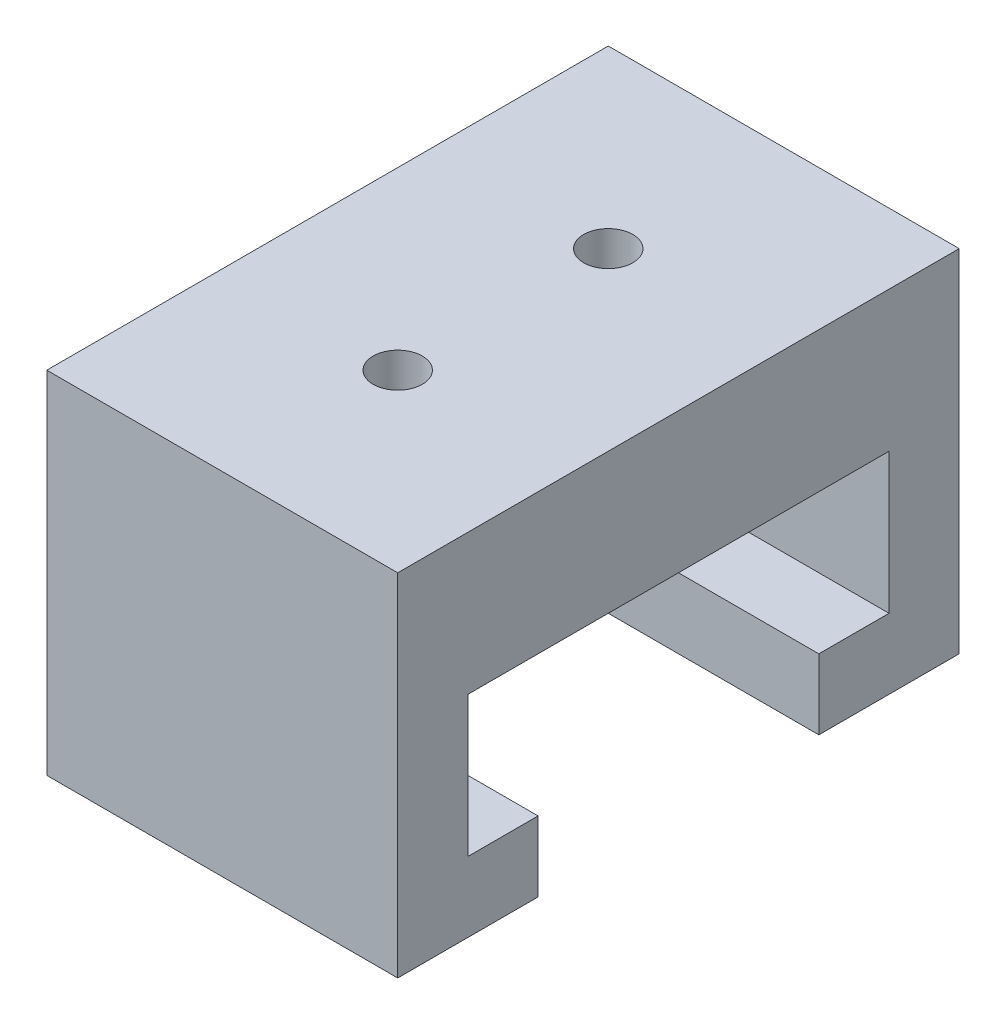
ISO-10303-21;
HEADER;
FILE_DESCRIPTION(('STEP AP214'),'2;1');
FILE_NAME('part.step','',(''),(''),'','','');
FILE_SCHEMA(('AUTOMOTIVE_DESIGN { 1 0 10303 214 1 1 1 1 }'));
ENDSEC;
DATA;
#1=APPLICATION_CONTEXT('core data for automotive mechanical design processes');
#2=APPLICATION_PROTOCOL_DEFINITION('international standard','automotive_design',2000,#1);
#3=PRODUCT_CONTEXT('',#1,'mechanical');
#4=PRODUCT('Part','Part','',(#3));
#5=PRODUCT_RELATED_PRODUCT_CATEGORY('part','',(#4));
#6=PRODUCT_DEFINITION_FORMATION('','',#4);
#7=PRODUCT_DEFINITION_CONTEXT('part definition',#1,'design');
#8=PRODUCT_DEFINITION('design','',#6,#7);
#9=PRODUCT_DEFINITION_SHAPE('','',#8);
#10=(LENGTH_UNIT() NAMED_UNIT(*) SI_UNIT(.MILLI.,.METRE.));
#11=(NAMED_UNIT(*) PLANE_ANGLE_UNIT() SI_UNIT($,.RADIAN.));
#12=(NAMED_UNIT(*) SI_UNIT($,.STERADIAN.) SOLID_ANGLE_UNIT());
#13=UNCERTAINTY_MEASURE_WITH_UNIT(LENGTH_MEASURE(1.E-05),#10,'distance_accuracy_value','');
#14=(GEOMETRIC_REPRESENTATION_CONTEXT(3) GLOBAL_UNCERTAINTY_ASSIGNED_CONTEXT((#13)) GLOBAL_UNIT_ASSIGNED_CONTEXT((#10,
#11,#12)) REPRESENTATION_CONTEXT('',''));
#15=CARTESIAN_POINT('',(0.,0.,0.));
#16=DIRECTION('',(0.,0.,1.));
#17=DIRECTION('',(1.,0.,0.));
#18=AXIS2_PLACEMENT_3D('',#15,#16,#17);
#19=CARTESIAN_POINT('',(62.5,-133.,21.25));
#20=DIRECTION('',(0.,-1.,0.));
#21=DIRECTION('',(0.,0.,-1.));
#22=AXIS2_PLACEMENT_3D('',#19,#20,#21);
#23=CYLINDRICAL_SURFACE('',#22,1.75);
#24=CARTESIAN_POINT('',(62.5,-150.,21.25));
#25=DIRECTION('',(0.,1.,0.));
#26=DIRECTION('',(0.,0.,1.));
#27=AXIS2_PLACEMENT_3D('',#24,#25,#26);
#28=CIRCLE('',#27,1.75);
#29=CARTESIAN_POINT('',(62.5,-150.,23.));
#30=VERTEX_POINT('',#29);
#31=EDGE_CURVE('E223',#30,#30,#28,.T.);
#32=ORIENTED_EDGE('',*,*,#31,.T.);
#33=EDGE_LOOP('',(#32));
#34=FACE_BOUND('',#33,.T.);
#35=CARTESIAN_POINT('',(62.5,-155.,21.25));
#36=DIRECTION('',(0.,-1.,0.));
#37=DIRECTION('',(0.,0.,-1.));
#38=AXIS2_PLACEMENT_3D('',#35,#36,#37);
#39=CIRCLE('',#38,1.75);
#40=CARTESIAN_POINT('',(62.5,-155.,19.5));
#41=VERTEX_POINT('',#40);
#42=EDGE_CURVE('E47',#41,#41,#39,.F.);
#43=ORIENTED_EDGE('',*,*,#42,.F.);
#44=EDGE_LOOP('',(#43));
#45=FACE_BOUND('',#44,.T.);
#46=ADVANCED_FACE('F43',(#34,#45),#23,.F.);
#47=CARTESIAN_POINT('',(62.5,-133.,36.25));
#48=DIRECTION('',(0.,-1.,0.));
#49=DIRECTION('',(0.,0.,-1.));
#50=AXIS2_PLACEMENT_3D('',#47,#48,#49);
#51=CYLINDRICAL_SURFACE('',#50,1.75);
#52=CARTESIAN_POINT('',(62.5,-150.,36.25));
#53=DIRECTION('',(0.,1.,0.));
#54=DIRECTION('',(0.,0.,1.));
#55=AXIS2_PLACEMENT_3D('',#52,#53,#54);
#56=CIRCLE('',#55,1.75);
#57=CARTESIAN_POINT('',(62.5,-150.,38.));
#58=VERTEX_POINT('',#57);
#59=EDGE_CURVE('E170',#58,#58,#56,.T.);
#60=ORIENTED_EDGE('',*,*,#59,.T.);
#61=EDGE_LOOP('',(#60));
#62=FACE_BOUND('',#61,.T.);
#63=CARTESIAN_POINT('',(62.5,-155.,36.25));
#64=DIRECTION('',(0.,-1.,0.));
#65=DIRECTION('',(0.,0.,-1.));
#66=AXIS2_PLACEMENT_3D('',#63,#64,#65);
#67=CIRCLE('',#66,1.75);
#68=CARTESIAN_POINT('',(62.5,-155.,34.5));
#69=VERTEX_POINT('',#68);
#70=EDGE_CURVE('E217',#69,#69,#67,.F.);
#71=ORIENTED_EDGE('',*,*,#70,.F.);
#72=EDGE_LOOP('',(#71));
#73=FACE_BOUND('',#72,.T.);
#74=ADVANCED_FACE('F298',(#62,#73),#51,.F.);
#75=CARTESIAN_POINT('',(50.,-175.,48.75));
#76=DIRECTION('',(0.,-1.,0.));
#77=DIRECTION('',(0.,0.,-1.));
#78=AXIS2_PLACEMENT_3D('',#75,#76,#77);
#79=PLANE('',#78);
#80=DIRECTION('',(0.,0.,-1.));
#81=VECTOR('',#80,1.);
#82=CARTESIAN_POINT('',(75.,-175.,48.75));
#83=LINE('',#82,#81);
#84=CARTESIAN_POINT('',(75.,-175.,48.75));
#85=VERTEX_POINT('',#84);
#86=CARTESIAN_POINT('',(75.,-175.,38.75));
#87=VERTEX_POINT('',#86);
#88=EDGE_CURVE('E166',#85,#87,#83,.T.);
#89=ORIENTED_EDGE('',*,*,#88,.F.);
#90=DIRECTION('',(1.,0.,0.));
#91=VECTOR('',#90,1.);
#92=CARTESIAN_POINT('',(50.,-175.,48.75));
#93=LINE('',#92,#91);
#94=CARTESIAN_POINT('',(50.,-175.,48.75));
#95=VERTEX_POINT('',#94);
#96=EDGE_CURVE('E11',#95,#85,#93,.T.);
#97=ORIENTED_EDGE('',*,*,#96,.F.);
#98=DIRECTION('',(0.,0.,-1.));
#99=VECTOR('',#98,1.);
#100=CARTESIAN_POINT('',(50.,-175.,48.75));
#101=LINE('',#100,#99);
#102=CARTESIAN_POINT('',(50.,-175.,38.75));
#103=VERTEX_POINT('',#102);
#104=EDGE_CURVE('E199',#95,#103,#101,.T.);
#105=ORIENTED_EDGE('',*,*,#104,.T.);
#106=DIRECTION('',(1.,0.,0.));
#107=VECTOR('',#106,1.);
#108=CARTESIAN_POINT('',(50.,-175.,38.75));
#109=LINE('',#108,#107);
#110=EDGE_CURVE('E112',#103,#87,#109,.T.);
#111=ORIENTED_EDGE('',*,*,#110,.T.);
#112=EDGE_LOOP('',(#89,#97,#105,#111));
#113=FACE_BOUND('',#112,.T.);
#114=ADVANCED_FACE('F45',(#113),#79,.T.);
#115=CARTESIAN_POINT('',(50.,-150.,48.75));
#116=DIRECTION('',(0.,0.,1.));
#117=DIRECTION('',(1.,0.,0.));
#118=AXIS2_PLACEMENT_3D('',#115,#116,#117);
#119=PLANE('',#118);
#120=DIRECTION('',(0.,-1.,0.));
#121=VECTOR('',#120,1.);
#122=CARTESIAN_POINT('',(75.,-150.,48.75));
#123=LINE('',#122,#121);
#124=CARTESIAN_POINT('',(75.,-150.,48.75));
#125=VERTEX_POINT('',#124);
#126=EDGE_CURVE('E197',#125,#85,#123,.T.);
#127=ORIENTED_EDGE('',*,*,#126,.F.);
#128=DIRECTION('',(1.,0.,0.));
#129=VECTOR('',#128,1.);
#130=CARTESIAN_POINT('',(50.,-150.,48.75));
#131=LINE('',#130,#129);
#132=CARTESIAN_POINT('',(50.,-150.,48.75));
#133=VERTEX_POINT('',#132);
#134=EDGE_CURVE('E53',#133,#125,#131,.T.);
#135=ORIENTED_EDGE('',*,*,#134,.F.);
#136=DIRECTION('',(0.,-1.,0.));
#137=VECTOR('',#136,1.);
#138=CARTESIAN_POINT('',(50.,-150.,48.75));
#139=LINE('',#138,#137);
#140=EDGE_CURVE('E156',#133,#95,#139,.T.);
#141=ORIENTED_EDGE('',*,*,#140,.T.);
#142=ORIENTED_EDGE('',*,*,#96,.T.);
#143=EDGE_LOOP('',(#127,#135,#141,#142));
#144=FACE_BOUND('',#143,.T.);
#145=ADVANCED_FACE('F288',(#144),#119,.T.);
#146=CARTESIAN_POINT('',(50.,-150.,8.74999999999997));
#147=DIRECTION('',(0.,1.,0.));
#148=DIRECTION('',(0.,0.,1.));
#149=AXIS2_PLACEMENT_3D('',#146,#147,#148);
#150=PLANE('',#149);
#151=ORIENTED_EDGE('',*,*,#59,.F.);
#152=EDGE_LOOP('',(#151));
#153=FACE_BOUND('',#152,.T.);
#154=ORIENTED_EDGE('',*,*,#31,.F.);
#155=EDGE_LOOP('',(#154));
#156=FACE_BOUND('',#155,.T.);
#157=DIRECTION('',(0.,0.,1.));
#158=VECTOR('',#157,1.);
#159=CARTESIAN_POINT('',(75.,-150.,8.74999999999997));
#160=LINE('',#159,#158);
#161=CARTESIAN_POINT('',(75.,-150.,8.74999999999997));
#162=VERTEX_POINT('',#161);
#163=EDGE_CURVE('E143',#162,#125,#160,.T.);
#164=ORIENTED_EDGE('',*,*,#163,.F.);
#165=DIRECTION('',(1.,0.,0.));
#166=VECTOR('',#165,1.);
#167=CARTESIAN_POINT('',(50.,-150.,8.74999999999997));
#168=LINE('',#167,#166);
#169=CARTESIAN_POINT('',(50.,-150.,8.74999999999997));
#170=VERTEX_POINT('',#169);
#171=EDGE_CURVE('E138',#170,#162,#168,.T.);
#172=ORIENTED_EDGE('',*,*,#171,.F.);
#173=DIRECTION('',(0.,0.,1.));
#174=VECTOR('',#173,1.);
#175=CARTESIAN_POINT('',(50.,-150.,8.74999999999997));
#176=LINE('',#175,#174);
#177=EDGE_CURVE('E141',#170,#133,#176,.T.);
#178=ORIENTED_EDGE('',*,*,#177,.T.);
#179=ORIENTED_EDGE('',*,*,#134,.T.);
#180=EDGE_LOOP('',(#164,#172,#178,#179));
#181=FACE_BOUND('',#180,.T.);
#182=ADVANCED_FACE('F140',(#153,#156,#181),#150,.T.);
#183=CARTESIAN_POINT('',(50.,-175.,8.74999999999997));
#184=DIRECTION('',(0.,0.,-1.));
#185=DIRECTION('',(-1.,0.,0.));
#186=AXIS2_PLACEMENT_3D('',#183,#184,#185);
#187=PLANE('',#186);
#188=DIRECTION('',(0.,1.,0.));
#189=VECTOR('',#188,1.);
#190=CARTESIAN_POINT('',(75.,-175.,8.74999999999997));
#191=LINE('',#190,#189);
#192=CARTESIAN_POINT('',(75.,-175.,8.74999999999997));
#193=VERTEX_POINT('',#192);
#194=EDGE_CURVE('E194',#193,#162,#191,.T.);
#195=ORIENTED_EDGE('',*,*,#194,.F.);
#196=DIRECTION('',(1.,0.,0.));
#197=VECTOR('',#196,1.);
#198=CARTESIAN_POINT('',(50.,-175.,8.74999999999997));
#199=LINE('',#198,#197);
#200=CARTESIAN_POINT('',(50.,-175.,8.74999999999997));
#201=VERTEX_POINT('',#200);
#202=EDGE_CURVE('E148',#201,#193,#199,.T.);
#203=ORIENTED_EDGE('',*,*,#202,.F.);
#204=DIRECTION('',(0.,1.,0.));
#205=VECTOR('',#204,1.);
#206=CARTESIAN_POINT('',(50.,-175.,8.74999999999997));
#207=LINE('',#206,#205);
#208=EDGE_CURVE('E154',#201,#170,#207,.T.);
#209=ORIENTED_EDGE('',*,*,#208,.T.);
#210=ORIENTED_EDGE('',*,*,#171,.T.);
#211=EDGE_LOOP('',(#195,#203,#209,#210));
#212=FACE_BOUND('',#211,.T.);
#213=ADVANCED_FACE('F158',(#212),#187,.T.);
#214=CARTESIAN_POINT('',(50.,-175.,18.75));
#215=DIRECTION('',(0.,-1.,0.));
#216=DIRECTION('',(0.,0.,-1.));
#217=AXIS2_PLACEMENT_3D('',#214,#215,#216);
#218=PLANE('',#217);
#219=DIRECTION('',(0.,0.,-1.));
#220=VECTOR('',#219,1.);
#221=CARTESIAN_POINT('',(75.,-175.,18.75));
#222=LINE('',#221,#220);
#223=CARTESIAN_POINT('',(75.,-175.,18.75));
#224=VERTEX_POINT('',#223);
#225=EDGE_CURVE('E191',#224,#193,#222,.T.);
#226=ORIENTED_EDGE('',*,*,#225,.F.);
#227=DIRECTION('',(1.,0.,0.));
#228=VECTOR('',#227,1.);
#229=CARTESIAN_POINT('',(50.,-175.,18.75));
#230=LINE('',#229,#228);
#231=CARTESIAN_POINT('',(50.,-175.,18.75));
#232=VERTEX_POINT('',#231);
#233=EDGE_CURVE('E203',#232,#224,#230,.T.);
#234=ORIENTED_EDGE('',*,*,#233,.F.);
#235=DIRECTION('',(0.,0.,-1.));
#236=VECTOR('',#235,1.);
#237=CARTESIAN_POINT('',(50.,-175.,18.75));
#238=LINE('',#237,#236);
#239=EDGE_CURVE('E159',#232,#201,#238,.T.);
#240=ORIENTED_EDGE('',*,*,#239,.T.);
#241=ORIENTED_EDGE('',*,*,#202,.T.);
#242=EDGE_LOOP('',(#226,#234,#240,#241));
#243=FACE_BOUND('',#242,.T.);
#244=ADVANCED_FACE('F425',(#243),#218,.T.);
#245=CARTESIAN_POINT('',(50.,-170.,18.75));
#246=DIRECTION('',(0.,0.,1.));
#247=DIRECTION('',(1.,0.,0.));
#248=AXIS2_PLACEMENT_3D('',#245,#246,#247);
#249=PLANE('',#248);
#250=DIRECTION('',(0.,-1.,0.));
#251=VECTOR('',#250,1.);
#252=CARTESIAN_POINT('',(75.,-170.,18.75));
#253=LINE('',#252,#251);
#254=CARTESIAN_POINT('',(75.,-170.,18.75));
#255=VERTEX_POINT('',#254);
#256=EDGE_CURVE('E188',#255,#224,#253,.T.);
#257=ORIENTED_EDGE('',*,*,#256,.F.);
#258=DIRECTION('',(1.,0.,0.));
#259=VECTOR('',#258,1.);
#260=CARTESIAN_POINT('',(50.,-170.,18.75));
#261=LINE('',#260,#259);
#262=CARTESIAN_POINT('',(50.,-170.,18.75));
#263=VERTEX_POINT('',#262);
#264=EDGE_CURVE('E205',#263,#255,#261,.T.);
#265=ORIENTED_EDGE('',*,*,#264,.F.);
#266=DIRECTION('',(0.,-1.,0.));
#267=VECTOR('',#266,1.);
#268=CARTESIAN_POINT('',(50.,-170.,18.75));
#269=LINE('',#268,#267);
#270=EDGE_CURVE('E161',#263,#232,#269,.T.);
#271=ORIENTED_EDGE('',*,*,#270,.T.);
#272=ORIENTED_EDGE('',*,*,#233,.T.);
#273=EDGE_LOOP('',(#257,#265,#271,#272));
#274=FACE_BOUND('',#273,.T.);
#275=ADVANCED_FACE('F263',(#274),#249,.T.);
#276=CARTESIAN_POINT('',(50.,-170.,13.75));
#277=DIRECTION('',(0.,1.,0.));
#278=DIRECTION('',(0.,0.,1.));
#279=AXIS2_PLACEMENT_3D('',#276,#277,#278);
#280=PLANE('',#279);
#281=DIRECTION('',(0.,0.,1.));
#282=VECTOR('',#281,1.);
#283=CARTESIAN_POINT('',(75.,-170.,13.75));
#284=LINE('',#283,#282);
#285=CARTESIAN_POINT('',(75.,-170.,13.75));
#286=VERTEX_POINT('',#285);
#287=EDGE_CURVE('E185',#286,#255,#284,.T.);
#288=ORIENTED_EDGE('',*,*,#287,.F.);
#289=DIRECTION('',(1.,0.,0.));
#290=VECTOR('',#289,1.);
#291=CARTESIAN_POINT('',(50.,-170.,13.75));
#292=LINE('',#291,#290);
#293=CARTESIAN_POINT('',(50.,-170.,13.75));
#294=VERTEX_POINT('',#293);
#295=EDGE_CURVE('E207',#294,#286,#292,.T.);
#296=ORIENTED_EDGE('',*,*,#295,.F.);
#297=DIRECTION('',(0.,0.,1.));
#298=VECTOR('',#297,1.);
#299=CARTESIAN_POINT('',(50.,-170.,13.75));
#300=LINE('',#299,#298);
#301=EDGE_CURVE('E257',#294,#263,#300,.T.);
#302=ORIENTED_EDGE('',*,*,#301,.T.);
#303=ORIENTED_EDGE('',*,*,#264,.T.);
#304=EDGE_LOOP('',(#288,#296,#302,#303));
#305=FACE_BOUND('',#304,.T.);
#306=ADVANCED_FACE('F269',(#305),#280,.T.);
#307=CARTESIAN_POINT('',(50.,-160.,13.75));
#308=DIRECTION('',(0.,0.,1.));
#309=DIRECTION('',(0.,-1.,0.));
#310=AXIS2_PLACEMENT_3D('',#307,#308,#309);
#311=PLANE('',#310);
#312=DIRECTION('',(0.,-1.,0.));
#313=VECTOR('',#312,1.);
#314=CARTESIAN_POINT('',(75.,-160.,13.75));
#315=LINE('',#314,#313);
#316=CARTESIAN_POINT('',(75.,-160.,13.75));
#317=VERTEX_POINT('',#316);
#318=EDGE_CURVE('E182',#317,#286,#315,.T.);
#319=ORIENTED_EDGE('',*,*,#318,.F.);
#320=DIRECTION('',(1.,0.,0.));
#321=VECTOR('',#320,1.);
#322=CARTESIAN_POINT('',(50.,-160.,13.75));
#323=LINE('',#322,#321);
#324=CARTESIAN_POINT('',(50.,-160.,13.75));
#325=VERTEX_POINT('',#324);
#326=EDGE_CURVE('E209',#325,#317,#323,.T.);
#327=ORIENTED_EDGE('',*,*,#326,.F.);
#328=DIRECTION('',(0.,-1.,0.));
#329=VECTOR('',#328,1.);
#330=CARTESIAN_POINT('',(50.,-160.,13.75));
#331=LINE('',#330,#329);
#332=EDGE_CURVE('E254',#325,#294,#331,.T.);
#333=ORIENTED_EDGE('',*,*,#332,.T.);
#334=ORIENTED_EDGE('',*,*,#295,.T.);
#335=EDGE_LOOP('',(#319,#327,#333,#334));
#336=FACE_BOUND('',#335,.T.);
#337=ADVANCED_FACE('F272',(#336),#311,.T.);
#338=CARTESIAN_POINT('',(50.,-160.,43.75));
#339=DIRECTION('',(0.,-1.,0.));
#340=DIRECTION('',(0.,0.,-1.));
#341=AXIS2_PLACEMENT_3D('',#338,#339,#340);
#342=PLANE('',#341);
#343=CARTESIAN_POINT('',(62.5,-160.,36.25));
#344=DIRECTION('',(0.,-1.,0.));
#345=DIRECTION('',(0.,0.,-1.));
#346=AXIS2_PLACEMENT_3D('',#343,#344,#345);
#347=CIRCLE('',#346,2.5);
#348=CARTESIAN_POINT('',(62.5,-160.,33.75));
#349=VERTEX_POINT('',#348);
#350=EDGE_CURVE('E219',#349,#349,#347,.T.);
#351=ORIENTED_EDGE('',*,*,#350,.F.);
#352=EDGE_LOOP('',(#351));
#353=FACE_BOUND('',#352,.T.);
#354=CARTESIAN_POINT('',(62.5,-160.,21.25));
#355=DIRECTION('',(0.,-1.,0.));
#356=DIRECTION('',(0.,0.,-1.));
#357=AXIS2_PLACEMENT_3D('',#354,#355,#356);
#358=CIRCLE('',#357,2.5);
#359=CARTESIAN_POINT('',(62.5,-160.,18.75));
#360=VERTEX_POINT('',#359);
#361=EDGE_CURVE('E230',#360,#360,#358,.T.);
#362=ORIENTED_EDGE('',*,*,#361,.F.);
#363=EDGE_LOOP('',(#362));
#364=FACE_BOUND('',#363,.T.);
#365=DIRECTION('',(0.,0.,-1.));
#366=VECTOR('',#365,1.);
#367=CARTESIAN_POINT('',(75.,-160.,43.75));
#368=LINE('',#367,#366);
#369=CARTESIAN_POINT('',(75.,-160.,43.75));
#370=VERTEX_POINT('',#369);
#371=EDGE_CURVE('E179',#370,#317,#368,.T.);
#372=ORIENTED_EDGE('',*,*,#371,.F.);
#373=DIRECTION('',(1.,0.,0.));
#374=VECTOR('',#373,1.);
#375=CARTESIAN_POINT('',(50.,-160.,43.75));
#376=LINE('',#375,#374);
#377=CARTESIAN_POINT('',(50.,-160.,43.75));
#378=VERTEX_POINT('',#377);
#379=EDGE_CURVE('E211',#378,#370,#376,.T.);
#380=ORIENTED_EDGE('',*,*,#379,.F.);
#381=DIRECTION('',(0.,0.,-1.));
#382=VECTOR('',#381,1.);
#383=CARTESIAN_POINT('',(50.,-160.,43.75));
#384=LINE('',#383,#382);
#385=EDGE_CURVE('E251',#378,#325,#384,.T.);
#386=ORIENTED_EDGE('',*,*,#385,.T.);
#387=ORIENTED_EDGE('',*,*,#326,.T.);
#388=EDGE_LOOP('',(#372,#380,#386,#387));
#389=FACE_BOUND('',#388,.T.);
#390=ADVANCED_FACE('F277',(#353,#364,#389),#342,.T.);
#391=CARTESIAN_POINT('',(50.,-170.,43.75));
#392=DIRECTION('',(0.,0.,-1.));
#393=DIRECTION('',(-1.,0.,0.));
#394=AXIS2_PLACEMENT_3D('',#391,#392,#393);
#395=PLANE('',#394);
#396=DIRECTION('',(0.,1.,0.));
#397=VECTOR('',#396,1.);
#398=CARTESIAN_POINT('',(75.,-170.,43.75));
#399=LINE('',#398,#397);
#400=CARTESIAN_POINT('',(75.,-170.,43.75));
#401=VERTEX_POINT('',#400);
#402=EDGE_CURVE('E176',#401,#370,#399,.T.);
#403=ORIENTED_EDGE('',*,*,#402,.F.);
#404=DIRECTION('',(1.,0.,0.));
#405=VECTOR('',#404,1.);
#406=CARTESIAN_POINT('',(50.,-170.,43.75));
#407=LINE('',#406,#405);
#408=CARTESIAN_POINT('',(50.,-170.,43.75));
#409=VERTEX_POINT('',#408);
#410=EDGE_CURVE('E213',#409,#401,#407,.T.);
#411=ORIENTED_EDGE('',*,*,#410,.F.);
#412=DIRECTION('',(0.,1.,0.));
#413=VECTOR('',#412,1.);
#414=CARTESIAN_POINT('',(50.,-170.,43.75));
#415=LINE('',#414,#413);
#416=EDGE_CURVE('E248',#409,#378,#415,.T.);
#417=ORIENTED_EDGE('',*,*,#416,.T.);
#418=ORIENTED_EDGE('',*,*,#379,.T.);
#419=EDGE_LOOP('',(#403,#411,#417,#418));
#420=FACE_BOUND('',#419,.T.);
#421=ADVANCED_FACE('F280',(#420),#395,.T.);
#422=CARTESIAN_POINT('',(50.,-170.,38.75));
#423=DIRECTION('',(0.,1.,0.));
#424=DIRECTION('',(0.,0.,1.));
#425=AXIS2_PLACEMENT_3D('',#422,#423,#424);
#426=PLANE('',#425);
#427=DIRECTION('',(0.,0.,1.));
#428=VECTOR('',#427,1.);
#429=CARTESIAN_POINT('',(75.,-170.,38.75));
#430=LINE('',#429,#428);
#431=CARTESIAN_POINT('',(75.,-170.,38.75));
#432=VERTEX_POINT('',#431);
#433=EDGE_CURVE('E173',#432,#401,#430,.T.);
#434=ORIENTED_EDGE('',*,*,#433,.F.);
#435=DIRECTION('',(1.,0.,0.));
#436=VECTOR('',#435,1.);
#437=CARTESIAN_POINT('',(50.,-170.,38.75));
#438=LINE('',#437,#436);
#439=CARTESIAN_POINT('',(50.,-170.,38.75));
#440=VERTEX_POINT('',#439);
#441=EDGE_CURVE('E215',#440,#432,#438,.T.);
#442=ORIENTED_EDGE('',*,*,#441,.F.);
#443=DIRECTION('',(0.,0.,1.));
#444=VECTOR('',#443,1.);
#445=CARTESIAN_POINT('',(50.,-170.,38.75));
#446=LINE('',#445,#444);
#447=EDGE_CURVE('E245',#440,#409,#446,.T.);
#448=ORIENTED_EDGE('',*,*,#447,.T.);
#449=ORIENTED_EDGE('',*,*,#410,.T.);
#450=EDGE_LOOP('',(#434,#442,#448,#449));
#451=FACE_BOUND('',#450,.T.);
#452=ADVANCED_FACE('F284',(#451),#426,.T.);
#453=CARTESIAN_POINT('',(50.,-175.,38.75));
#454=DIRECTION('',(0.,0.,-1.));
#455=DIRECTION('',(-1.,0.,0.));
#456=AXIS2_PLACEMENT_3D('',#453,#454,#455);
#457=PLANE('',#456);
#458=DIRECTION('',(0.,1.,0.));
#459=VECTOR('',#458,1.);
#460=CARTESIAN_POINT('',(75.,-175.,38.75));
#461=LINE('',#460,#459);
#462=EDGE_CURVE('E169',#87,#432,#461,.T.);
#463=ORIENTED_EDGE('',*,*,#462,.F.);
#464=ORIENTED_EDGE('',*,*,#110,.F.);
#465=DIRECTION('',(0.,1.,0.));
#466=VECTOR('',#465,1.);
#467=CARTESIAN_POINT('',(50.,-175.,38.75));
#468=LINE('',#467,#466);
#469=EDGE_CURVE('E243',#103,#440,#468,.T.);
#470=ORIENTED_EDGE('',*,*,#469,.T.);
#471=ORIENTED_EDGE('',*,*,#441,.T.);
#472=EDGE_LOOP('',(#463,#464,#470,#471));
#473=FACE_BOUND('',#472,.T.);
#474=ADVANCED_FACE('F285',(#473),#457,.T.);
#475=CARTESIAN_POINT('',(50.,0.,0.));
#476=DIRECTION('',(1.,0.,0.));
#477=DIRECTION('',(0.,0.,-1.));
#478=AXIS2_PLACEMENT_3D('',#475,#476,#477);
#479=PLANE('',#478);
#480=ORIENTED_EDGE('',*,*,#104,.F.);
#481=ORIENTED_EDGE('',*,*,#140,.F.);
#482=ORIENTED_EDGE('',*,*,#177,.F.);
#483=ORIENTED_EDGE('',*,*,#208,.F.);
#484=ORIENTED_EDGE('',*,*,#239,.F.);
#485=ORIENTED_EDGE('',*,*,#270,.F.);
#486=ORIENTED_EDGE('',*,*,#301,.F.);
#487=ORIENTED_EDGE('',*,*,#332,.F.);
#488=ORIENTED_EDGE('',*,*,#385,.F.);
#489=ORIENTED_EDGE('',*,*,#416,.F.);
#490=ORIENTED_EDGE('',*,*,#447,.F.);
#491=ORIENTED_EDGE('',*,*,#469,.F.);
#492=EDGE_LOOP('',(#480,#481,#482,#483,#484,#485,#486,#487,#488,#489,#490,#491));
#493=FACE_BOUND('',#492,.T.);
#494=ADVANCED_FACE('F152',(#493),#479,.F.);
#495=CARTESIAN_POINT('',(75.,0.,0.));
#496=DIRECTION('',(1.,0.,0.));
#497=DIRECTION('',(0.,0.,-1.));
#498=AXIS2_PLACEMENT_3D('',#495,#496,#497);
#499=PLANE('',#498);
#500=ORIENTED_EDGE('',*,*,#88,.T.);
#501=ORIENTED_EDGE('',*,*,#462,.T.);
#502=ORIENTED_EDGE('',*,*,#433,.T.);
#503=ORIENTED_EDGE('',*,*,#402,.T.);
#504=ORIENTED_EDGE('',*,*,#371,.T.);
#505=ORIENTED_EDGE('',*,*,#318,.T.);
#506=ORIENTED_EDGE('',*,*,#287,.T.);
#507=ORIENTED_EDGE('',*,*,#256,.T.);
#508=ORIENTED_EDGE('',*,*,#225,.T.);
#509=ORIENTED_EDGE('',*,*,#194,.T.);
#510=ORIENTED_EDGE('',*,*,#163,.T.);
#511=ORIENTED_EDGE('',*,*,#126,.T.);
#512=EDGE_LOOP('',(#500,#501,#502,#503,#504,#505,#506,#507,#508,#509,#510,#511));
#513=FACE_BOUND('',#512,.T.);
#514=ADVANCED_FACE('F287',(#513),#499,.T.);
#515=CARTESIAN_POINT('',(62.5,-155.,36.25));
#516=DIRECTION('',(0.,-1.,0.));
#517=DIRECTION('',(0.,0.,-1.));
#518=AXIS2_PLACEMENT_3D('',#515,#516,#517);
#519=PLANE('',#518);
#520=CARTESIAN_POINT('',(62.5,-155.,36.25));
#521=DIRECTION('',(0.,-1.,0.));
#522=DIRECTION('',(0.,0.,-1.));
#523=AXIS2_PLACEMENT_3D('',#520,#521,#522);
#524=CIRCLE('',#523,2.5);
#525=CARTESIAN_POINT('',(62.5,-155.,33.75));
#526=VERTEX_POINT('',#525);
#527=EDGE_CURVE('E225',#526,#526,#524,.T.);
#528=ORIENTED_EDGE('',*,*,#527,.T.);
#529=EDGE_LOOP('',(#528));
#530=FACE_BOUND('',#529,.T.);
#531=ORIENTED_EDGE('',*,*,#70,.T.);
#532=EDGE_LOOP('',(#531));
#533=FACE_BOUND('',#532,.T.);
#534=ADVANCED_FACE('F314',(#530,#533),#519,.T.);
#535=CARTESIAN_POINT('',(62.5,-155.,36.25));
#536=DIRECTION('',(0.,-1.,0.));
#537=DIRECTION('',(0.,0.,-1.));
#538=AXIS2_PLACEMENT_3D('',#535,#536,#537);
#539=CYLINDRICAL_SURFACE('',#538,2.5);
#540=ORIENTED_EDGE('',*,*,#527,.F.);
#541=EDGE_LOOP('',(#540));
#542=FACE_BOUND('',#541,.T.);
#543=ORIENTED_EDGE('',*,*,#350,.T.);
#544=EDGE_LOOP('',(#543));
#545=FACE_BOUND('',#544,.T.);
#546=ADVANCED_FACE('F319',(#542,#545),#539,.F.);
#547=CARTESIAN_POINT('',(62.5,-155.,21.25));
#548=DIRECTION('',(0.,-1.,0.));
#549=DIRECTION('',(0.,0.,-1.));
#550=AXIS2_PLACEMENT_3D('',#547,#548,#549);
#551=PLANE('',#550);
#552=CARTESIAN_POINT('',(62.5,-155.,21.25));
#553=DIRECTION('',(0.,-1.,0.));
#554=DIRECTION('',(0.,0.,-1.));
#555=AXIS2_PLACEMENT_3D('',#552,#553,#554);
#556=CIRCLE('',#555,2.5);
#557=CARTESIAN_POINT('',(62.5,-155.,18.75));
#558=VERTEX_POINT('',#557);
#559=EDGE_CURVE('E235',#558,#558,#556,.T.);
#560=ORIENTED_EDGE('',*,*,#559,.T.);
#561=EDGE_LOOP('',(#560));
#562=FACE_BOUND('',#561,.T.);
#563=ORIENTED_EDGE('',*,*,#42,.T.);
#564=EDGE_LOOP('',(#563));
#565=FACE_BOUND('',#564,.T.);
#566=ADVANCED_FACE('F326',(#562,#565),#551,.T.);
#567=CARTESIAN_POINT('',(62.5,-155.,21.25));
#568=DIRECTION('',(0.,-1.,0.));
#569=DIRECTION('',(0.,0.,-1.));
#570=AXIS2_PLACEMENT_3D('',#567,#568,#569);
#571=CYLINDRICAL_SURFACE('',#570,2.5);
#572=ORIENTED_EDGE('',*,*,#559,.F.);
#573=EDGE_LOOP('',(#572));
#574=FACE_BOUND('',#573,.T.);
#575=ORIENTED_EDGE('',*,*,#361,.T.);
#576=EDGE_LOOP('',(#575));
#577=FACE_BOUND('',#576,.T.);
#578=ADVANCED_FACE('F330',(#574,#577),#571,.F.);
#579=CLOSED_SHELL('',(#46,#74,#114,#145,#182,#213,#244,#275,#306,#337,#390,#421,#452,#474,#494,
#514,#534,#546,#566,#578));
#580=MANIFOLD_SOLID_BREP('B2',#579);
#581=ADVANCED_BREP_SHAPE_REPRESENTATION('',(#18,#580),#14);
#582=SHAPE_DEFINITION_REPRESENTATION(#9,#581);
ENDSEC;
END-ISO-10303-21;
